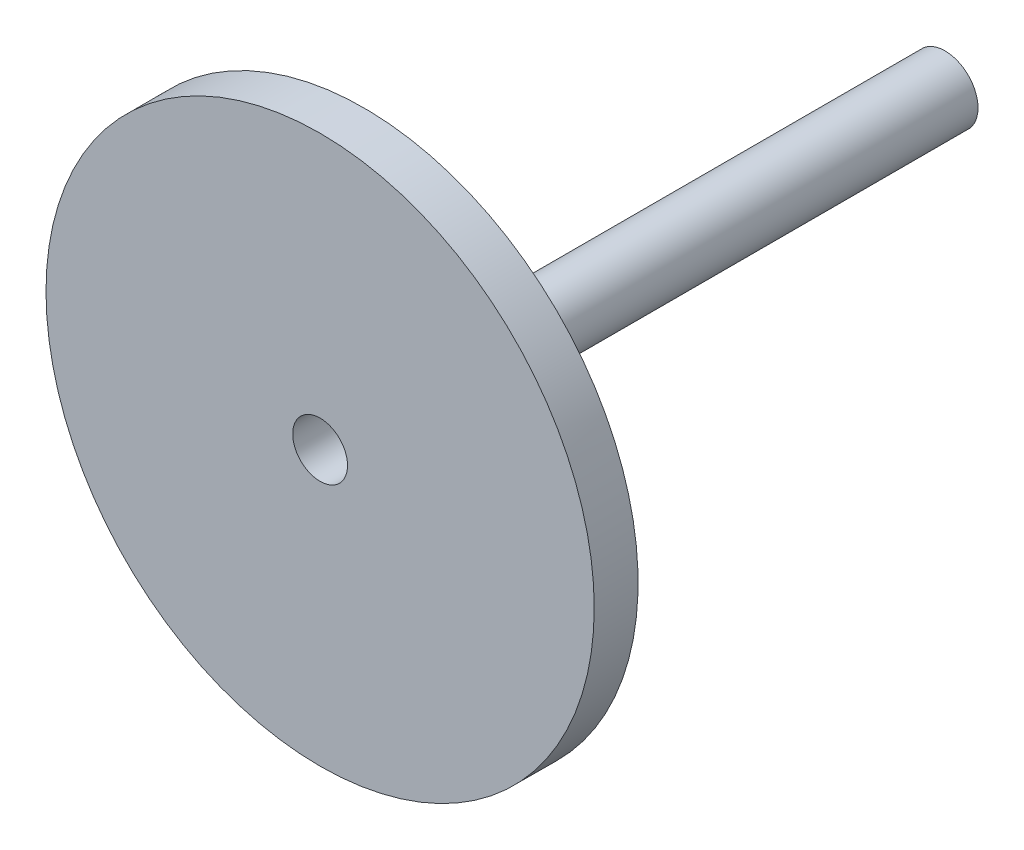
ISO-10303-21;
HEADER;
FILE_DESCRIPTION(('STEP AP214'),'2;1');
FILE_NAME('part.step','',(''),(''),'','','');
FILE_SCHEMA(('AUTOMOTIVE_DESIGN { 1 0 10303 214 1 1 1 1 }'));
ENDSEC;
DATA;
#1=APPLICATION_CONTEXT('core data for automotive mechanical design processes');
#2=APPLICATION_PROTOCOL_DEFINITION('international standard','automotive_design',2000,#1);
#3=PRODUCT_CONTEXT('',#1,'mechanical');
#4=PRODUCT('Part','Part','',(#3));
#5=PRODUCT_RELATED_PRODUCT_CATEGORY('part','',(#4));
#6=PRODUCT_DEFINITION_FORMATION('','',#4);
#7=PRODUCT_DEFINITION_CONTEXT('part definition',#1,'design');
#8=PRODUCT_DEFINITION('design','',#6,#7);
#9=PRODUCT_DEFINITION_SHAPE('','',#8);
#10=(LENGTH_UNIT() NAMED_UNIT(*) SI_UNIT(.MILLI.,.METRE.));
#11=(NAMED_UNIT(*) PLANE_ANGLE_UNIT() SI_UNIT($,.RADIAN.));
#12=(NAMED_UNIT(*) SI_UNIT($,.STERADIAN.) SOLID_ANGLE_UNIT());
#13=UNCERTAINTY_MEASURE_WITH_UNIT(LENGTH_MEASURE(1.E-05),#10,'distance_accuracy_value','');
#14=(GEOMETRIC_REPRESENTATION_CONTEXT(3) GLOBAL_UNCERTAINTY_ASSIGNED_CONTEXT((#13)) GLOBAL_UNIT_ASSIGNED_CONTEXT((#10,
#11,#12)) REPRESENTATION_CONTEXT('',''));
#15=CARTESIAN_POINT('',(0.,0.,0.));
#16=DIRECTION('',(0.,0.,1.));
#17=DIRECTION('',(1.,0.,0.));
#18=AXIS2_PLACEMENT_3D('',#15,#16,#17);
#19=CARTESIAN_POINT('',(0.,0.,0.2));
#20=DIRECTION('',(0.,0.,-1.));
#21=DIRECTION('',(-1.,0.,0.));
#22=AXIS2_PLACEMENT_3D('',#19,#20,#21);
#23=CYLINDRICAL_SURFACE('',#22,2.5);
#24=CARTESIAN_POINT('',(0.,0.,0.2));
#25=DIRECTION('',(0.,0.,1.));
#26=DIRECTION('',(1.,0.,0.));
#27=AXIS2_PLACEMENT_3D('',#24,#25,#26);
#28=CIRCLE('',#27,2.5);
#29=CARTESIAN_POINT('',(2.5,0.,0.2));
#30=VERTEX_POINT('',#29);
#31=EDGE_CURVE('E51',#30,#30,#28,.T.);
#32=ORIENTED_EDGE('',*,*,#31,.F.);
#33=EDGE_LOOP('',(#32));
#34=FACE_BOUND('',#33,.T.);
#35=CARTESIAN_POINT('',(0.,0.,-0.2));
#36=DIRECTION('',(0.,0.,-1.));
#37=DIRECTION('',(-1.,0.,0.));
#38=AXIS2_PLACEMENT_3D('',#35,#36,#37);
#39=CIRCLE('',#38,2.5);
#40=CARTESIAN_POINT('',(-2.5,0.,-0.2));
#41=VERTEX_POINT('',#40);
#42=EDGE_CURVE('E57',#41,#41,#39,.T.);
#43=ORIENTED_EDGE('',*,*,#42,.F.);
#44=EDGE_LOOP('',(#43));
#45=FACE_BOUND('',#44,.T.);
#46=ADVANCED_FACE('F37',(#34,#45),#23,.T.);
#47=CARTESIAN_POINT('',(0.,0.,0.2));
#48=DIRECTION('',(0.,0.,1.));
#49=DIRECTION('',(1.,0.,0.));
#50=AXIS2_PLACEMENT_3D('',#47,#48,#49);
#51=PLANE('',#50);
#52=CARTESIAN_POINT('',(0.,0.,0.2));
#53=DIRECTION('',(0.,0.,1.));
#54=DIRECTION('',(1.,0.,0.));
#55=AXIS2_PLACEMENT_3D('',#52,#53,#54);
#56=CIRCLE('',#55,0.25);
#57=CARTESIAN_POINT('',(0.25,0.,0.2));
#58=VERTEX_POINT('',#57);
#59=EDGE_CURVE('E41',#58,#58,#56,.T.);
#60=ORIENTED_EDGE('',*,*,#59,.F.);
#61=EDGE_LOOP('',(#60));
#62=FACE_BOUND('',#61,.T.);
#63=ORIENTED_EDGE('',*,*,#31,.T.);
#64=EDGE_LOOP('',(#63));
#65=FACE_BOUND('',#64,.T.);
#66=ADVANCED_FACE('F108',(#62,#65),#51,.T.);
#67=CARTESIAN_POINT('',(0.,0.,-0.2));
#68=DIRECTION('',(0.,0.,-1.));
#69=DIRECTION('',(-1.,0.,0.));
#70=AXIS2_PLACEMENT_3D('',#67,#68,#69);
#71=PLANE('',#70);
#72=ORIENTED_EDGE('',*,*,#42,.T.);
#73=EDGE_LOOP('',(#72));
#74=FACE_BOUND('',#73,.T.);
#75=CARTESIAN_POINT('',(0.,0.,-0.2));
#76=DIRECTION('',(0.,0.,-1.));
#77=DIRECTION('',(-1.,0.,0.));
#78=AXIS2_PLACEMENT_3D('',#75,#76,#77);
#79=CIRCLE('',#78,2.4);
#80=CARTESIAN_POINT('',(-2.4,0.,-0.2));
#81=VERTEX_POINT('',#80);
#82=EDGE_CURVE('E61',#81,#81,#79,.T.);
#83=ORIENTED_EDGE('',*,*,#82,.F.);
#84=EDGE_LOOP('',(#83));
#85=FACE_BOUND('',#84,.T.);
#86=ADVANCED_FACE('F111',(#74,#85),#71,.T.);
#87=CARTESIAN_POINT('',(0.,0.,-0.2));
#88=DIRECTION('',(0.,0.,1.));
#89=DIRECTION('',(1.,0.,0.));
#90=AXIS2_PLACEMENT_3D('',#87,#88,#89);
#91=CYLINDRICAL_SURFACE('',#90,2.4);
#92=ORIENTED_EDGE('',*,*,#82,.T.);
#93=EDGE_LOOP('',(#92));
#94=FACE_BOUND('',#93,.T.);
#95=CARTESIAN_POINT('',(0.,0.,0.));
#96=DIRECTION('',(0.,0.,-1.));
#97=DIRECTION('',(-1.,0.,0.));
#98=AXIS2_PLACEMENT_3D('',#95,#96,#97);
#99=CIRCLE('',#98,2.4);
#100=CARTESIAN_POINT('',(-2.4,0.,0.));
#101=VERTEX_POINT('',#100);
#102=EDGE_CURVE('E62',#101,#101,#99,.T.);
#103=ORIENTED_EDGE('',*,*,#102,.F.);
#104=EDGE_LOOP('',(#103));
#105=FACE_BOUND('',#104,.T.);
#106=ADVANCED_FACE('F121',(#94,#105),#91,.F.);
#107=CARTESIAN_POINT('',(0.,0.,0.));
#108=DIRECTION('',(0.,0.,1.));
#109=DIRECTION('',(1.,0.,0.));
#110=AXIS2_PLACEMENT_3D('',#107,#108,#109);
#111=PLANE('',#110);
#112=CARTESIAN_POINT('',(0.,0.,0.));
#113=DIRECTION('',(0.,0.,-1.));
#114=DIRECTION('',(-1.,0.,0.));
#115=AXIS2_PLACEMENT_3D('',#112,#113,#114);
#116=CIRCLE('',#115,1.75);
#117=CARTESIAN_POINT('',(-1.75,0.,0.));
#118=VERTEX_POINT('',#117);
#119=EDGE_CURVE('E70',#118,#118,#116,.T.);
#120=ORIENTED_EDGE('',*,*,#119,.F.);
#121=EDGE_LOOP('',(#120));
#122=FACE_BOUND('',#121,.T.);
#123=ORIENTED_EDGE('',*,*,#102,.T.);
#124=EDGE_LOOP('',(#123));
#125=FACE_BOUND('',#124,.T.);
#126=ADVANCED_FACE('F127',(#122,#125),#111,.F.);
#127=CARTESIAN_POINT('',(0.,0.,0.1));
#128=DIRECTION('',(0.,0.,-1.));
#129=DIRECTION('',(-1.,0.,0.));
#130=AXIS2_PLACEMENT_3D('',#127,#128,#129);
#131=CYLINDRICAL_SURFACE('',#130,1.75);
#132=CARTESIAN_POINT('',(0.,0.,0.1));
#133=DIRECTION('',(0.,0.,-1.));
#134=DIRECTION('',(-1.,0.,0.));
#135=AXIS2_PLACEMENT_3D('',#132,#133,#134);
#136=CIRCLE('',#135,1.75);
#137=CARTESIAN_POINT('',(-1.75,0.,0.1));
#138=VERTEX_POINT('',#137);
#139=EDGE_CURVE('E66',#138,#138,#136,.T.);
#140=ORIENTED_EDGE('',*,*,#139,.F.);
#141=EDGE_LOOP('',(#140));
#142=FACE_BOUND('',#141,.T.);
#143=ORIENTED_EDGE('',*,*,#119,.T.);
#144=EDGE_LOOP('',(#143));
#145=FACE_BOUND('',#144,.T.);
#146=ADVANCED_FACE('F132',(#142,#145),#131,.F.);
#147=CARTESIAN_POINT('',(0.,0.,0.1));
#148=DIRECTION('',(0.,0.,-1.));
#149=DIRECTION('',(-1.,0.,0.));
#150=AXIS2_PLACEMENT_3D('',#147,#148,#149);
#151=PLANE('',#150);
#152=CARTESIAN_POINT('',(0.,0.,0.1));
#153=DIRECTION('',(0.,0.,-1.));
#154=DIRECTION('',(-1.,0.,0.));
#155=AXIS2_PLACEMENT_3D('',#152,#153,#154);
#156=CIRCLE('',#155,1.65);
#157=CARTESIAN_POINT('',(-1.65,0.,0.1));
#158=VERTEX_POINT('',#157);
#159=EDGE_CURVE('E74',#158,#158,#156,.T.);
#160=ORIENTED_EDGE('',*,*,#159,.F.);
#161=EDGE_LOOP('',(#160));
#162=FACE_BOUND('',#161,.T.);
#163=ORIENTED_EDGE('',*,*,#139,.T.);
#164=EDGE_LOOP('',(#163));
#165=FACE_BOUND('',#164,.T.);
#166=ADVANCED_FACE('F139',(#162,#165),#151,.T.);
#167=CARTESIAN_POINT('',(0.,0.,0.1));
#168=DIRECTION('',(0.,0.,-1.));
#169=DIRECTION('',(-1.,0.,0.));
#170=AXIS2_PLACEMENT_3D('',#167,#168,#169);
#171=CYLINDRICAL_SURFACE('',#170,1.65);
#172=ORIENTED_EDGE('',*,*,#159,.T.);
#173=EDGE_LOOP('',(#172));
#174=FACE_BOUND('',#173,.T.);
#175=CARTESIAN_POINT('',(0.,0.,0.));
#176=DIRECTION('',(0.,0.,-1.));
#177=DIRECTION('',(-1.,0.,0.));
#178=AXIS2_PLACEMENT_3D('',#175,#176,#177);
#179=CIRCLE('',#178,1.65);
#180=CARTESIAN_POINT('',(-1.65,0.,0.));
#181=VERTEX_POINT('',#180);
#182=EDGE_CURVE('E78',#181,#181,#179,.T.);
#183=ORIENTED_EDGE('',*,*,#182,.F.);
#184=EDGE_LOOP('',(#183));
#185=FACE_BOUND('',#184,.T.);
#186=ADVANCED_FACE('F145',(#174,#185),#171,.T.);
#187=CARTESIAN_POINT('',(0.,0.,0.));
#188=DIRECTION('',(0.,0.,1.));
#189=DIRECTION('',(1.,0.,0.));
#190=AXIS2_PLACEMENT_3D('',#187,#188,#189);
#191=CIRCLE('',#190,0.5);
#192=CARTESIAN_POINT('',(0.5,0.,0.));
#193=VERTEX_POINT('',#192);
#194=EDGE_CURVE('E93',#193,#193,#191,.T.);
#195=ORIENTED_EDGE('',*,*,#194,.T.);
#196=EDGE_LOOP('',(#195));
#197=FACE_BOUND('',#196,.T.);
#198=ORIENTED_EDGE('',*,*,#182,.T.);
#199=EDGE_LOOP('',(#198));
#200=FACE_BOUND('',#199,.T.);
#201=ADVANCED_FACE('F135',(#197,#200),#111,.F.);
#202=CARTESIAN_POINT('',(0.,0.,0.));
#203=DIRECTION('',(0.,0.,1.));
#204=DIRECTION('',(1.,0.,0.));
#205=AXIS2_PLACEMENT_3D('',#202,#203,#204);
#206=CONICAL_SURFACE('',#205,0.5,0.221314442347791);
#207=CARTESIAN_POINT('',(0.,0.,-0.576585365853659));
#208=DIRECTION('',(0.,0.,-1.));
#209=DIRECTION('',(-1.,0.,0.));
#210=AXIS2_PLACEMENT_3D('',#207,#208,#209);
#211=CIRCLE('',#210,0.370268292682927);
#212=CARTESIAN_POINT('',(-0.370268292682927,0.,-0.576585365853659));
#213=VERTEX_POINT('',#212);
#214=EDGE_CURVE('E46',#213,#213,#211,.F.);
#215=ORIENTED_EDGE('',*,*,#214,.T.);
#216=EDGE_LOOP('',(#215));
#217=FACE_BOUND('',#216,.T.);
#218=ORIENTED_EDGE('',*,*,#194,.F.);
#219=EDGE_LOOP('',(#218));
#220=FACE_BOUND('',#219,.T.);
#221=ADVANCED_FACE('F144',(#217,#220),#206,.T.);
#222=CARTESIAN_POINT('',(0.3,0.,-0.6));
#223=DIRECTION('',(0.,0.,-1.));
#224=DIRECTION('',(-1.,0.,0.));
#225=AXIS2_PLACEMENT_3D('',#222,#223,#224);
#226=PLANE('',#225);
#227=CARTESIAN_POINT('',(0.,0.,-0.6));
#228=DIRECTION('',(0.,0.,-1.));
#229=DIRECTION('',(-1.,0.,0.));
#230=AXIS2_PLACEMENT_3D('',#227,#228,#229);
#231=CIRCLE('',#230,0.341);
#232=CARTESIAN_POINT('',(-0.341,0.,-0.6));
#233=VERTEX_POINT('',#232);
#234=EDGE_CURVE('E10',#233,#233,#231,.T.);
#235=ORIENTED_EDGE('',*,*,#234,.T.);
#236=EDGE_LOOP('',(#235));
#237=FACE_BOUND('',#236,.T.);
#238=CARTESIAN_POINT('',(0.,0.,-0.6));
#239=DIRECTION('',(0.,0.,1.));
#240=DIRECTION('',(1.,0.,0.));
#241=AXIS2_PLACEMENT_3D('',#238,#239,#240);
#242=CIRCLE('',#241,0.3);
#243=CARTESIAN_POINT('',(0.3,0.,-0.6));
#244=VERTEX_POINT('',#243);
#245=EDGE_CURVE('E97',#244,#244,#242,.T.);
#246=ORIENTED_EDGE('',*,*,#245,.T.);
#247=EDGE_LOOP('',(#246));
#248=FACE_BOUND('',#247,.T.);
#249=ADVANCED_FACE('F151',(#237,#248),#226,.T.);
#250=CARTESIAN_POINT('',(0.,0.,-5.5));
#251=DIRECTION('',(0.,0.,1.));
#252=DIRECTION('',(1.,0.,0.));
#253=AXIS2_PLACEMENT_3D('',#250,#251,#252);
#254=CYLINDRICAL_SURFACE('',#253,0.25);
#255=CARTESIAN_POINT('',(0.,0.,-5.5));
#256=DIRECTION('',(0.,0.,-1.));
#257=DIRECTION('',(-1.,0.,0.));
#258=AXIS2_PLACEMENT_3D('',#255,#256,#257);
#259=CIRCLE('',#258,0.25);
#260=CARTESIAN_POINT('',(-0.25,0.,-5.5));
#261=VERTEX_POINT('',#260);
#262=EDGE_CURVE('E89',#261,#261,#259,.T.);
#263=ORIENTED_EDGE('',*,*,#262,.T.);
#264=EDGE_LOOP('',(#263));
#265=FACE_BOUND('',#264,.T.);
#266=ORIENTED_EDGE('',*,*,#59,.T.);
#267=EDGE_LOOP('',(#266));
#268=FACE_BOUND('',#267,.T.);
#269=ADVANCED_FACE('F106',(#265,#268),#254,.F.);
#270=CARTESIAN_POINT('',(0.,0.,-5.5));
#271=DIRECTION('',(0.,0.,-1.));
#272=DIRECTION('',(-1.,0.,0.));
#273=AXIS2_PLACEMENT_3D('',#270,#271,#272);
#274=PLANE('',#273);
#275=CARTESIAN_POINT('',(0.,0.,-5.5));
#276=DIRECTION('',(0.,0.,-1.));
#277=DIRECTION('',(-1.,0.,0.));
#278=AXIS2_PLACEMENT_3D('',#275,#276,#277);
#279=CIRCLE('',#278,0.3);
#280=CARTESIAN_POINT('',(-0.3,0.,-5.5));
#281=VERTEX_POINT('',#280);
#282=EDGE_CURVE('E82',#281,#281,#279,.T.);
#283=ORIENTED_EDGE('',*,*,#282,.T.);
#284=EDGE_LOOP('',(#283));
#285=FACE_BOUND('',#284,.T.);
#286=ORIENTED_EDGE('',*,*,#262,.F.);
#287=EDGE_LOOP('',(#286));
#288=FACE_BOUND('',#287,.T.);
#289=ADVANCED_FACE('F170',(#285,#288),#274,.T.);
#290=CARTESIAN_POINT('',(0.,0.,-5.5));
#291=DIRECTION('',(0.,0.,1.));
#292=DIRECTION('',(1.,0.,0.));
#293=AXIS2_PLACEMENT_3D('',#290,#291,#292);
#294=CYLINDRICAL_SURFACE('',#293,0.3);
#295=ORIENTED_EDGE('',*,*,#245,.F.);
#296=EDGE_LOOP('',(#295));
#297=FACE_BOUND('',#296,.T.);
#298=ORIENTED_EDGE('',*,*,#282,.F.);
#299=EDGE_LOOP('',(#298));
#300=FACE_BOUND('',#299,.T.);
#301=ADVANCED_FACE('F167',(#297,#300),#294,.T.);
#302=CARTESIAN_POINT('',(0.,0.,-0.57));
#303=DIRECTION('',(0.,0.,-1.));
#304=DIRECTION('',(-1.,0.,0.));
#305=AXIS2_PLACEMENT_3D('',#302,#303,#304);
#306=TOROIDAL_SURFACE('',#305,0.341,0.03);
#307=ORIENTED_EDGE('',*,*,#234,.F.);
#308=EDGE_LOOP('',(#307));
#309=FACE_BOUND('',#308,.T.);
#310=ORIENTED_EDGE('',*,*,#214,.F.);
#311=EDGE_LOOP('',(#310));
#312=FACE_BOUND('',#311,.T.);
#313=ADVANCED_FACE('F39',(#309,#312),#306,.T.);
#314=CLOSED_SHELL('',(#46,#66,#86,#106,#126,#146,#166,#186,#201,#221,#249,#269,#289,#301,#313));
#315=MANIFOLD_SOLID_BREP('B2',#314);
#316=ADVANCED_BREP_SHAPE_REPRESENTATION('',(#18,#315),#14);
#317=SHAPE_DEFINITION_REPRESENTATION(#9,#316);
ENDSEC;
END-ISO-10303-21;
